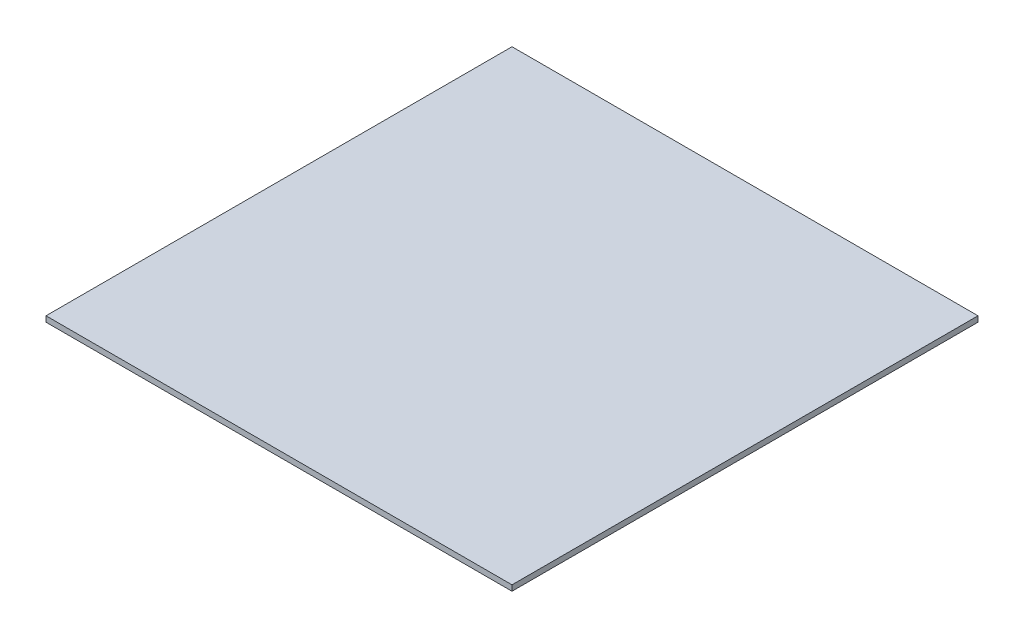
ISO-10303-21;
HEADER;
FILE_DESCRIPTION(('STEP AP214'),'2;1');
FILE_NAME('part.step','',(''),(''),'','','');
FILE_SCHEMA(('AUTOMOTIVE_DESIGN { 1 0 10303 214 1 1 1 1 }'));
ENDSEC;
DATA;
#1=APPLICATION_CONTEXT('core data for automotive mechanical design processes');
#2=APPLICATION_PROTOCOL_DEFINITION('international standard','automotive_design',2000,#1);
#3=PRODUCT_CONTEXT('',#1,'mechanical');
#4=PRODUCT('Part','Part','',(#3));
#5=PRODUCT_RELATED_PRODUCT_CATEGORY('part','',(#4));
#6=PRODUCT_DEFINITION_FORMATION('','',#4);
#7=PRODUCT_DEFINITION_CONTEXT('part definition',#1,'design');
#8=PRODUCT_DEFINITION('design','',#6,#7);
#9=PRODUCT_DEFINITION_SHAPE('','',#8);
#10=(LENGTH_UNIT() NAMED_UNIT(*) SI_UNIT(.MILLI.,.METRE.));
#11=(NAMED_UNIT(*) PLANE_ANGLE_UNIT() SI_UNIT($,.RADIAN.));
#12=(NAMED_UNIT(*) SI_UNIT($,.STERADIAN.) SOLID_ANGLE_UNIT());
#13=UNCERTAINTY_MEASURE_WITH_UNIT(LENGTH_MEASURE(1.E-05),#10,'distance_accuracy_value','');
#14=(GEOMETRIC_REPRESENTATION_CONTEXT(3) GLOBAL_UNCERTAINTY_ASSIGNED_CONTEXT((#13)) GLOBAL_UNIT_ASSIGNED_CONTEXT((#10,
#11,#12)) REPRESENTATION_CONTEXT('',''));
#15=CARTESIAN_POINT('',(0.,0.,0.));
#16=DIRECTION('',(0.,0.,1.));
#17=DIRECTION('',(1.,0.,0.));
#18=AXIS2_PLACEMENT_3D('',#15,#16,#17);
#19=CARTESIAN_POINT('',(0.,6.,0.));
#20=DIRECTION('',(1.,0.,0.));
#21=DIRECTION('',(0.,0.,-1.));
#22=AXIS2_PLACEMENT_3D('',#19,#20,#21);
#23=PLANE('',#22);
#24=DIRECTION('',(0.,0.,1.));
#25=VECTOR('',#24,1.);
#26=CARTESIAN_POINT('',(0.,0.,0.));
#27=LINE('',#26,#25);
#28=CARTESIAN_POINT('',(0.,0.,-500.));
#29=VERTEX_POINT('',#28);
#30=CARTESIAN_POINT('',(0.,0.,0.));
#31=VERTEX_POINT('',#30);
#32=EDGE_CURVE('E96',#29,#31,#27,.T.);
#33=ORIENTED_EDGE('',*,*,#32,.T.);
#34=DIRECTION('',(0.,-1.,0.));
#35=VECTOR('',#34,1.);
#36=CARTESIAN_POINT('',(0.,6.,0.));
#37=LINE('',#36,#35);
#38=CARTESIAN_POINT('',(0.,6.,0.));
#39=VERTEX_POINT('',#38);
#40=EDGE_CURVE('E11',#39,#31,#37,.T.);
#41=ORIENTED_EDGE('',*,*,#40,.F.);
#42=DIRECTION('',(0.,0.,1.));
#43=VECTOR('',#42,1.);
#44=CARTESIAN_POINT('',(0.,6.,0.));
#45=LINE('',#44,#43);
#46=CARTESIAN_POINT('',(0.,6.,-500.));
#47=VERTEX_POINT('',#46);
#48=EDGE_CURVE('E84',#47,#39,#45,.T.);
#49=ORIENTED_EDGE('',*,*,#48,.F.);
#50=DIRECTION('',(0.,-1.,0.));
#51=VECTOR('',#50,1.);
#52=CARTESIAN_POINT('',(0.,6.,-500.));
#53=LINE('',#52,#51);
#54=EDGE_CURVE('E92',#47,#29,#53,.T.);
#55=ORIENTED_EDGE('',*,*,#54,.T.);
#56=EDGE_LOOP('',(#33,#41,#49,#55));
#57=FACE_BOUND('',#56,.T.);
#58=ADVANCED_FACE('F33',(#57),#23,.F.);
#59=CARTESIAN_POINT('',(0.,6.,0.));
#60=DIRECTION('',(0.,0.,-1.));
#61=DIRECTION('',(-1.,0.,0.));
#62=AXIS2_PLACEMENT_3D('',#59,#60,#61);
#63=PLANE('',#62);
#64=DIRECTION('',(1.,0.,0.));
#65=VECTOR('',#64,1.);
#66=CARTESIAN_POINT('',(0.,0.,0.));
#67=LINE('',#66,#65);
#68=CARTESIAN_POINT('',(500.,0.,0.));
#69=VERTEX_POINT('',#68);
#70=EDGE_CURVE('E88',#31,#69,#67,.T.);
#71=ORIENTED_EDGE('',*,*,#70,.T.);
#72=DIRECTION('',(0.,-1.,0.));
#73=VECTOR('',#72,1.);
#74=CARTESIAN_POINT('',(500.,6.,0.));
#75=LINE('',#74,#73);
#76=CARTESIAN_POINT('',(500.,6.,0.));
#77=VERTEX_POINT('',#76);
#78=EDGE_CURVE('E41',#77,#69,#75,.T.);
#79=ORIENTED_EDGE('',*,*,#78,.F.);
#80=DIRECTION('',(1.,0.,0.));
#81=VECTOR('',#80,1.);
#82=CARTESIAN_POINT('',(0.,6.,0.));
#83=LINE('',#82,#81);
#84=EDGE_CURVE('E79',#39,#77,#83,.T.);
#85=ORIENTED_EDGE('',*,*,#84,.F.);
#86=ORIENTED_EDGE('',*,*,#40,.T.);
#87=EDGE_LOOP('',(#71,#79,#85,#86));
#88=FACE_BOUND('',#87,.T.);
#89=ADVANCED_FACE('F87',(#88),#63,.F.);
#90=CARTESIAN_POINT('',(500.,6.,0.));
#91=DIRECTION('',(-1.,0.,0.));
#92=DIRECTION('',(0.,0.,1.));
#93=AXIS2_PLACEMENT_3D('',#90,#91,#92);
#94=PLANE('',#93);
#95=DIRECTION('',(0.,0.,-1.));
#96=VECTOR('',#95,1.);
#97=CARTESIAN_POINT('',(500.,0.,0.));
#98=LINE('',#97,#96);
#99=CARTESIAN_POINT('',(500.,0.,-500.));
#100=VERTEX_POINT('',#99);
#101=EDGE_CURVE('E66',#69,#100,#98,.T.);
#102=ORIENTED_EDGE('',*,*,#101,.T.);
#103=DIRECTION('',(0.,-1.,0.));
#104=VECTOR('',#103,1.);
#105=CARTESIAN_POINT('',(500.,6.,-500.));
#106=LINE('',#105,#104);
#107=CARTESIAN_POINT('',(500.,6.,-500.));
#108=VERTEX_POINT('',#107);
#109=EDGE_CURVE('E89',#108,#100,#106,.T.);
#110=ORIENTED_EDGE('',*,*,#109,.F.);
#111=DIRECTION('',(0.,0.,-1.));
#112=VECTOR('',#111,1.);
#113=CARTESIAN_POINT('',(500.,6.,0.));
#114=LINE('',#113,#112);
#115=EDGE_CURVE('E82',#77,#108,#114,.T.);
#116=ORIENTED_EDGE('',*,*,#115,.F.);
#117=ORIENTED_EDGE('',*,*,#78,.T.);
#118=EDGE_LOOP('',(#102,#110,#116,#117));
#119=FACE_BOUND('',#118,.T.);
#120=ADVANCED_FACE('F90',(#119),#94,.F.);
#121=CARTESIAN_POINT('',(0.,6.,-500.));
#122=DIRECTION('',(0.,0.,1.));
#123=DIRECTION('',(1.,0.,0.));
#124=AXIS2_PLACEMENT_3D('',#121,#122,#123);
#125=PLANE('',#124);
#126=DIRECTION('',(-1.,0.,0.));
#127=VECTOR('',#126,1.);
#128=CARTESIAN_POINT('',(0.,0.,-500.));
#129=LINE('',#128,#127);
#130=EDGE_CURVE('E72',#100,#29,#129,.T.);
#131=ORIENTED_EDGE('',*,*,#130,.T.);
#132=ORIENTED_EDGE('',*,*,#54,.F.);
#133=DIRECTION('',(-1.,0.,0.));
#134=VECTOR('',#133,1.);
#135=CARTESIAN_POINT('',(0.,6.,-500.));
#136=LINE('',#135,#134);
#137=EDGE_CURVE('E49',#108,#47,#136,.T.);
#138=ORIENTED_EDGE('',*,*,#137,.F.);
#139=ORIENTED_EDGE('',*,*,#109,.T.);
#140=EDGE_LOOP('',(#131,#132,#138,#139));
#141=FACE_BOUND('',#140,.T.);
#142=ADVANCED_FACE('F103',(#141),#125,.F.);
#143=CARTESIAN_POINT('',(0.,6.,0.));
#144=DIRECTION('',(0.,-1.,0.));
#145=DIRECTION('',(0.,0.,-1.));
#146=AXIS2_PLACEMENT_3D('',#143,#144,#145);
#147=PLANE('',#146);
#148=ORIENTED_EDGE('',*,*,#48,.T.);
#149=ORIENTED_EDGE('',*,*,#84,.T.);
#150=ORIENTED_EDGE('',*,*,#115,.T.);
#151=ORIENTED_EDGE('',*,*,#137,.T.);
#152=EDGE_LOOP('',(#148,#149,#150,#151));
#153=FACE_BOUND('',#152,.T.);
#154=ADVANCED_FACE('F80',(#153),#147,.F.);
#155=CARTESIAN_POINT('',(0.,0.,0.));
#156=DIRECTION('',(0.,-1.,0.));
#157=DIRECTION('',(0.,0.,-1.));
#158=AXIS2_PLACEMENT_3D('',#155,#156,#157);
#159=PLANE('',#158);
#160=ORIENTED_EDGE('',*,*,#32,.F.);
#161=ORIENTED_EDGE('',*,*,#130,.F.);
#162=ORIENTED_EDGE('',*,*,#101,.F.);
#163=ORIENTED_EDGE('',*,*,#70,.F.);
#164=EDGE_LOOP('',(#160,#161,#162,#163));
#165=FACE_BOUND('',#164,.T.);
#166=ADVANCED_FACE('F106',(#165),#159,.T.);
#167=CLOSED_SHELL('',(#58,#89,#120,#142,#154,#166));
#168=MANIFOLD_SOLID_BREP('B2',#167);
#169=ADVANCED_BREP_SHAPE_REPRESENTATION('',(#18,#168),#14);
#170=SHAPE_DEFINITION_REPRESENTATION(#9,#169);
ENDSEC;
END-ISO-10303-21;
